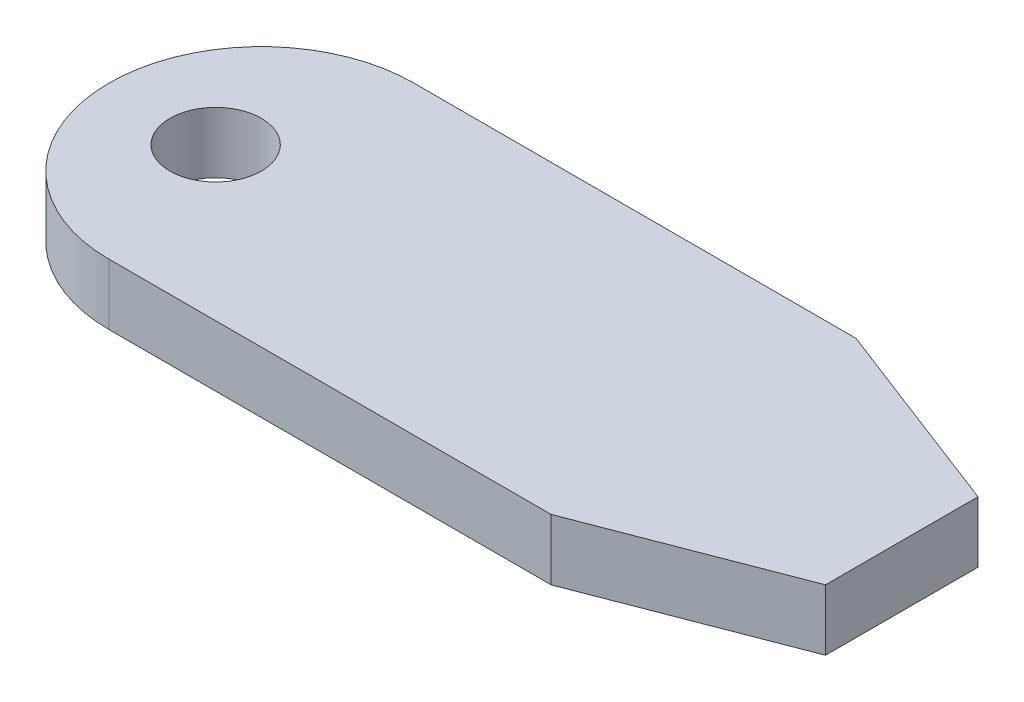
ISO-10303-21;
HEADER;
FILE_DESCRIPTION(('STEP AP214'),'2;1');
FILE_NAME('part.step','',(''),(''),'','','');
FILE_SCHEMA(('AUTOMOTIVE_DESIGN { 1 0 10303 214 1 1 1 1 }'));
ENDSEC;
DATA;
#1=APPLICATION_CONTEXT('core data for automotive mechanical design processes');
#2=APPLICATION_PROTOCOL_DEFINITION('international standard','automotive_design',2000,#1);
#3=PRODUCT_CONTEXT('',#1,'mechanical');
#4=PRODUCT('Part','Part','',(#3));
#5=PRODUCT_RELATED_PRODUCT_CATEGORY('part','',(#4));
#6=PRODUCT_DEFINITION_FORMATION('','',#4);
#7=PRODUCT_DEFINITION_CONTEXT('part definition',#1,'design');
#8=PRODUCT_DEFINITION('design','',#6,#7);
#9=PRODUCT_DEFINITION_SHAPE('','',#8);
#10=(LENGTH_UNIT() NAMED_UNIT(*) SI_UNIT(.MILLI.,.METRE.));
#11=(NAMED_UNIT(*) PLANE_ANGLE_UNIT() SI_UNIT($,.RADIAN.));
#12=(NAMED_UNIT(*) SI_UNIT($,.STERADIAN.) SOLID_ANGLE_UNIT());
#13=UNCERTAINTY_MEASURE_WITH_UNIT(LENGTH_MEASURE(1.E-05),#10,'distance_accuracy_value','');
#14=(GEOMETRIC_REPRESENTATION_CONTEXT(3) GLOBAL_UNCERTAINTY_ASSIGNED_CONTEXT((#13)) GLOBAL_UNIT_ASSIGNED_CONTEXT((#10,
#11,#12)) REPRESENTATION_CONTEXT('',''));
#15=CARTESIAN_POINT('',(0.,0.,0.));
#16=DIRECTION('',(0.,0.,1.));
#17=DIRECTION('',(1.,0.,0.));
#18=AXIS2_PLACEMENT_3D('',#15,#16,#17);
#19=CARTESIAN_POINT('',(0.,2.,0.));
#20=DIRECTION('',(0.,-1.,0.));
#21=DIRECTION('',(0.,0.,-1.));
#22=AXIS2_PLACEMENT_3D('',#19,#20,#21);
#23=PLANE('',#22);
#24=CARTESIAN_POINT('',(-8.,2.,0.));
#25=DIRECTION('',(0.,-1.,0.));
#26=DIRECTION('',(0.,0.,-1.));
#27=AXIS2_PLACEMENT_3D('',#24,#25,#26);
#28=CIRCLE('',#27,5.);
#29=CARTESIAN_POINT('',(-8.,2.,-5.));
#30=VERTEX_POINT('',#29);
#31=CARTESIAN_POINT('',(-13.,2.,0.));
#32=VERTEX_POINT('',#31);
#33=EDGE_CURVE('E61',#30,#32,#28,.F.);
#34=ORIENTED_EDGE('',*,*,#33,.T.);
#35=CARTESIAN_POINT('',(-8.,2.,0.));
#36=DIRECTION('',(0.,-1.,0.));
#37=DIRECTION('',(0.,0.,-1.));
#38=AXIS2_PLACEMENT_3D('',#35,#36,#37);
#39=CIRCLE('',#38,5.);
#40=CARTESIAN_POINT('',(-8.,2.,5.));
#41=VERTEX_POINT('',#40);
#42=EDGE_CURVE('E49',#32,#41,#39,.F.);
#43=ORIENTED_EDGE('',*,*,#42,.T.);
#44=DIRECTION('',(1.,0.,0.));
#45=VECTOR('',#44,1.);
#46=CARTESIAN_POINT('',(0.,2.,5.));
#47=LINE('',#46,#45);
#48=CARTESIAN_POINT('',(6.5,2.,5.));
#49=VERTEX_POINT('',#48);
#50=EDGE_CURVE('E98',#41,#49,#47,.T.);
#51=ORIENTED_EDGE('',*,*,#50,.T.);
#52=DIRECTION('',(0.93334560620306,0.,-0.358979079308869));
#53=VECTOR('',#52,1.);
#54=CARTESIAN_POINT('',(13.,2.,2.5));
#55=LINE('',#54,#53);
#56=CARTESIAN_POINT('',(13.,2.,2.5));
#57=VERTEX_POINT('',#56);
#58=EDGE_CURVE('E102',#49,#57,#55,.T.);
#59=ORIENTED_EDGE('',*,*,#58,.T.);
#60=DIRECTION('',(0.,0.,-1.));
#61=VECTOR('',#60,1.);
#62=CARTESIAN_POINT('',(13.,2.,0.));
#63=LINE('',#62,#61);
#64=CARTESIAN_POINT('',(13.,2.,-2.5));
#65=VERTEX_POINT('',#64);
#66=EDGE_CURVE('E127',#57,#65,#63,.T.);
#67=ORIENTED_EDGE('',*,*,#66,.T.);
#68=DIRECTION('',(-0.93334560620306,0.,-0.358979079308869));
#69=VECTOR('',#68,1.);
#70=CARTESIAN_POINT('',(13.,2.,-2.5));
#71=LINE('',#70,#69);
#72=CARTESIAN_POINT('',(6.5,2.,-5.));
#73=VERTEX_POINT('',#72);
#74=EDGE_CURVE('E130',#65,#73,#71,.T.);
#75=ORIENTED_EDGE('',*,*,#74,.T.);
#76=DIRECTION('',(-1.,0.,0.));
#77=VECTOR('',#76,1.);
#78=CARTESIAN_POINT('',(0.,2.,-5.));
#79=LINE('',#78,#77);
#80=EDGE_CURVE('E136',#73,#30,#79,.T.);
#81=ORIENTED_EDGE('',*,*,#80,.T.);
#82=EDGE_LOOP('',(#34,#43,#51,#59,#67,#75,#81));
#83=FACE_BOUND('',#82,.T.);
#84=CARTESIAN_POINT('',(-9.5,2.,0.));
#85=DIRECTION('',(0.,1.,0.));
#86=DIRECTION('',(0.,0.,1.));
#87=AXIS2_PLACEMENT_3D('',#84,#85,#86);
#88=CIRCLE('',#87,1.5);
#89=CARTESIAN_POINT('',(-9.5,2.,1.5));
#90=VERTEX_POINT('',#89);
#91=EDGE_CURVE('E143',#90,#90,#88,.T.);
#92=ORIENTED_EDGE('',*,*,#91,.F.);
#93=EDGE_LOOP('',(#92));
#94=FACE_BOUND('',#93,.T.);
#95=ADVANCED_FACE('F39',(#83,#94),#23,.F.);
#96=CARTESIAN_POINT('',(0.,0.,0.));
#97=DIRECTION('',(0.,-1.,0.));
#98=DIRECTION('',(0.,0.,-1.));
#99=AXIS2_PLACEMENT_3D('',#96,#97,#98);
#100=PLANE('',#99);
#101=DIRECTION('',(1.,0.,0.));
#102=VECTOR('',#101,1.);
#103=CARTESIAN_POINT('',(6.5,0.,5.));
#104=LINE('',#103,#102);
#105=CARTESIAN_POINT('',(-8.,0.,5.));
#106=VERTEX_POINT('',#105);
#107=CARTESIAN_POINT('',(6.5,0.,5.));
#108=VERTEX_POINT('',#107);
#109=EDGE_CURVE('E115',#106,#108,#104,.T.);
#110=ORIENTED_EDGE('',*,*,#109,.F.);
#111=CARTESIAN_POINT('',(-8.,0.,0.));
#112=DIRECTION('',(0.,-1.,0.));
#113=DIRECTION('',(0.,0.,-1.));
#114=AXIS2_PLACEMENT_3D('',#111,#112,#113);
#115=CIRCLE('',#114,5.);
#116=CARTESIAN_POINT('',(-13.,0.,0.));
#117=VERTEX_POINT('',#116);
#118=EDGE_CURVE('E169',#106,#117,#115,.T.);
#119=ORIENTED_EDGE('',*,*,#118,.T.);
#120=CARTESIAN_POINT('',(-8.,0.,0.));
#121=DIRECTION('',(0.,-1.,0.));
#122=DIRECTION('',(0.,0.,-1.));
#123=AXIS2_PLACEMENT_3D('',#120,#121,#122);
#124=CIRCLE('',#123,5.);
#125=CARTESIAN_POINT('',(-8.,0.,-5.));
#126=VERTEX_POINT('',#125);
#127=EDGE_CURVE('E166',#117,#126,#124,.T.);
#128=ORIENTED_EDGE('',*,*,#127,.T.);
#129=DIRECTION('',(-1.,0.,0.));
#130=VECTOR('',#129,1.);
#131=CARTESIAN_POINT('',(-13.,0.,-5.));
#132=LINE('',#131,#130);
#133=CARTESIAN_POINT('',(6.5,0.,-5.));
#134=VERTEX_POINT('',#133);
#135=EDGE_CURVE('E109',#134,#126,#132,.T.);
#136=ORIENTED_EDGE('',*,*,#135,.F.);
#137=DIRECTION('',(-0.93334560620306,0.,-0.358979079308869));
#138=VECTOR('',#137,1.);
#139=CARTESIAN_POINT('',(13.,0.,-2.5));
#140=LINE('',#139,#138);
#141=CARTESIAN_POINT('',(13.,0.,-2.5));
#142=VERTEX_POINT('',#141);
#143=EDGE_CURVE('E149',#142,#134,#140,.T.);
#144=ORIENTED_EDGE('',*,*,#143,.F.);
#145=DIRECTION('',(0.,0.,-1.));
#146=VECTOR('',#145,1.);
#147=CARTESIAN_POINT('',(13.,0.,-2.5));
#148=LINE('',#147,#146);
#149=CARTESIAN_POINT('',(13.,0.,2.5));
#150=VERTEX_POINT('',#149);
#151=EDGE_CURVE('E146',#150,#142,#148,.T.);
#152=ORIENTED_EDGE('',*,*,#151,.F.);
#153=DIRECTION('',(0.93334560620306,0.,-0.358979079308869));
#154=VECTOR('',#153,1.);
#155=CARTESIAN_POINT('',(13.,0.,2.5));
#156=LINE('',#155,#154);
#157=EDGE_CURVE('E142',#108,#150,#156,.T.);
#158=ORIENTED_EDGE('',*,*,#157,.F.);
#159=EDGE_LOOP('',(#110,#119,#128,#136,#144,#152,#158));
#160=FACE_BOUND('',#159,.T.);
#161=CARTESIAN_POINT('',(-9.5,0.,0.));
#162=DIRECTION('',(0.,1.,0.));
#163=DIRECTION('',(0.,0.,1.));
#164=AXIS2_PLACEMENT_3D('',#161,#162,#163);
#165=CIRCLE('',#164,1.5);
#166=CARTESIAN_POINT('',(-9.5,0.,1.5));
#167=VERTEX_POINT('',#166);
#168=EDGE_CURVE('E184',#167,#167,#165,.T.);
#169=ORIENTED_EDGE('',*,*,#168,.T.);
#170=EDGE_LOOP('',(#169));
#171=FACE_BOUND('',#170,.T.);
#172=ADVANCED_FACE('F177',(#160,#171),#100,.T.);
#173=CARTESIAN_POINT('',(6.5,2.,5.));
#174=DIRECTION('',(0.,0.,-1.));
#175=DIRECTION('',(-1.,0.,0.));
#176=AXIS2_PLACEMENT_3D('',#173,#174,#175);
#177=PLANE('',#176);
#178=ORIENTED_EDGE('',*,*,#50,.F.);
#179=DIRECTION('',(0.,-1.,0.));
#180=VECTOR('',#179,1.);
#181=CARTESIAN_POINT('',(-8.,2.,5.));
#182=LINE('',#181,#180);
#183=EDGE_CURVE('E120',#41,#106,#182,.T.);
#184=ORIENTED_EDGE('',*,*,#183,.T.);
#185=ORIENTED_EDGE('',*,*,#109,.T.);
#186=DIRECTION('',(0.,-1.,0.));
#187=VECTOR('',#186,1.);
#188=CARTESIAN_POINT('',(6.5,2.,5.));
#189=LINE('',#188,#187);
#190=EDGE_CURVE('E112',#49,#108,#189,.T.);
#191=ORIENTED_EDGE('',*,*,#190,.F.);
#192=EDGE_LOOP('',(#178,#184,#185,#191));
#193=FACE_BOUND('',#192,.T.);
#194=ADVANCED_FACE('F113',(#193),#177,.F.);
#195=CARTESIAN_POINT('',(13.,2.,2.5));
#196=DIRECTION('',(-0.358979079308869,0.,-0.93334560620306));
#197=DIRECTION('',(-0.93334560620306,0.,0.358979079308869));
#198=AXIS2_PLACEMENT_3D('',#195,#196,#197);
#199=PLANE('',#198);
#200=ORIENTED_EDGE('',*,*,#157,.T.);
#201=DIRECTION('',(0.,-1.,0.));
#202=VECTOR('',#201,1.);
#203=CARTESIAN_POINT('',(13.,2.,2.5));
#204=LINE('',#203,#202);
#205=EDGE_CURVE('E121',#57,#150,#204,.T.);
#206=ORIENTED_EDGE('',*,*,#205,.F.);
#207=ORIENTED_EDGE('',*,*,#58,.F.);
#208=ORIENTED_EDGE('',*,*,#190,.T.);
#209=EDGE_LOOP('',(#200,#206,#207,#208));
#210=FACE_BOUND('',#209,.T.);
#211=ADVANCED_FACE('F123',(#210),#199,.F.);
#212=CARTESIAN_POINT('',(13.,2.,-2.5));
#213=DIRECTION('',(-1.,0.,0.));
#214=DIRECTION('',(0.,0.,1.));
#215=AXIS2_PLACEMENT_3D('',#212,#213,#214);
#216=PLANE('',#215);
#217=ORIENTED_EDGE('',*,*,#151,.T.);
#218=DIRECTION('',(0.,-1.,0.));
#219=VECTOR('',#218,1.);
#220=CARTESIAN_POINT('',(13.,2.,-2.5));
#221=LINE('',#220,#219);
#222=EDGE_CURVE('E158',#65,#142,#221,.T.);
#223=ORIENTED_EDGE('',*,*,#222,.F.);
#224=ORIENTED_EDGE('',*,*,#66,.F.);
#225=ORIENTED_EDGE('',*,*,#205,.T.);
#226=EDGE_LOOP('',(#217,#223,#224,#225));
#227=FACE_BOUND('',#226,.T.);
#228=ADVANCED_FACE('F209',(#227),#216,.F.);
#229=CARTESIAN_POINT('',(13.,2.,-2.5));
#230=DIRECTION('',(-0.358979079308869,0.,0.93334560620306));
#231=DIRECTION('',(0.93334560620306,0.,0.358979079308869));
#232=AXIS2_PLACEMENT_3D('',#229,#230,#231);
#233=PLANE('',#232);
#234=ORIENTED_EDGE('',*,*,#143,.T.);
#235=DIRECTION('',(0.,-1.,0.));
#236=VECTOR('',#235,1.);
#237=CARTESIAN_POINT('',(6.5,2.,-5.));
#238=LINE('',#237,#236);
#239=EDGE_CURVE('E139',#73,#134,#238,.T.);
#240=ORIENTED_EDGE('',*,*,#239,.F.);
#241=ORIENTED_EDGE('',*,*,#74,.F.);
#242=ORIENTED_EDGE('',*,*,#222,.T.);
#243=EDGE_LOOP('',(#234,#240,#241,#242));
#244=FACE_BOUND('',#243,.T.);
#245=ADVANCED_FACE('F206',(#244),#233,.F.);
#246=CARTESIAN_POINT('',(-13.,2.,-5.));
#247=DIRECTION('',(0.,0.,1.));
#248=DIRECTION('',(1.,0.,0.));
#249=AXIS2_PLACEMENT_3D('',#246,#247,#248);
#250=PLANE('',#249);
#251=ORIENTED_EDGE('',*,*,#135,.T.);
#252=DIRECTION('',(0.,-1.,0.));
#253=VECTOR('',#252,1.);
#254=CARTESIAN_POINT('',(-8.,2.,-5.));
#255=LINE('',#254,#253);
#256=EDGE_CURVE('E11',#126,#30,#255,.F.);
#257=ORIENTED_EDGE('',*,*,#256,.T.);
#258=ORIENTED_EDGE('',*,*,#80,.F.);
#259=ORIENTED_EDGE('',*,*,#239,.T.);
#260=EDGE_LOOP('',(#251,#257,#258,#259));
#261=FACE_BOUND('',#260,.T.);
#262=ADVANCED_FACE('F203',(#261),#250,.F.);
#263=CARTESIAN_POINT('',(-9.5,2.,0.));
#264=DIRECTION('',(0.,-1.,0.));
#265=DIRECTION('',(0.,0.,-1.));
#266=AXIS2_PLACEMENT_3D('',#263,#264,#265);
#267=CYLINDRICAL_SURFACE('',#266,1.5);
#268=ORIENTED_EDGE('',*,*,#91,.T.);
#269=EDGE_LOOP('',(#268));
#270=FACE_BOUND('',#269,.T.);
#271=ORIENTED_EDGE('',*,*,#168,.F.);
#272=EDGE_LOOP('',(#271));
#273=FACE_BOUND('',#272,.T.);
#274=ADVANCED_FACE('F193',(#270,#273),#267,.F.);
#275=CARTESIAN_POINT('',(-8.,2.,0.));
#276=DIRECTION('',(0.,-1.,0.));
#277=DIRECTION('',(0.,0.,-1.));
#278=AXIS2_PLACEMENT_3D('',#275,#276,#277);
#279=CYLINDRICAL_SURFACE('',#278,5.);
#280=DIRECTION('',(0.,-1.,0.));
#281=VECTOR('',#280,1.);
#282=CARTESIAN_POINT('',(-13.,2.,0.));
#283=LINE('',#282,#281);
#284=EDGE_CURVE('E43',#32,#117,#283,.T.);
#285=ORIENTED_EDGE('',*,*,#284,.F.);
#286=ORIENTED_EDGE('',*,*,#33,.F.);
#287=ORIENTED_EDGE('',*,*,#256,.F.);
#288=ORIENTED_EDGE('',*,*,#127,.F.);
#289=EDGE_LOOP('',(#285,#286,#287,#288));
#290=FACE_BOUND('',#289,.T.);
#291=ADVANCED_FACE('F41',(#290),#279,.T.);
#292=CARTESIAN_POINT('',(-8.,2.,0.));
#293=DIRECTION('',(0.,-1.,0.));
#294=DIRECTION('',(0.,0.,-1.));
#295=AXIS2_PLACEMENT_3D('',#292,#293,#294);
#296=CYLINDRICAL_SURFACE('',#295,5.);
#297=ORIENTED_EDGE('',*,*,#42,.F.);
#298=ORIENTED_EDGE('',*,*,#284,.T.);
#299=ORIENTED_EDGE('',*,*,#118,.F.);
#300=ORIENTED_EDGE('',*,*,#183,.F.);
#301=EDGE_LOOP('',(#297,#298,#299,#300));
#302=FACE_BOUND('',#301,.T.);
#303=ADVANCED_FACE('F182',(#302),#296,.T.);
#304=CLOSED_SHELL('',(#95,#172,#194,#211,#228,#245,#262,#274,#291,#303));
#305=MANIFOLD_SOLID_BREP('B2',#304);
#306=ADVANCED_BREP_SHAPE_REPRESENTATION('',(#18,#305),#14);
#307=SHAPE_DEFINITION_REPRESENTATION(#9,#306);
ENDSEC;
END-ISO-10303-21;
